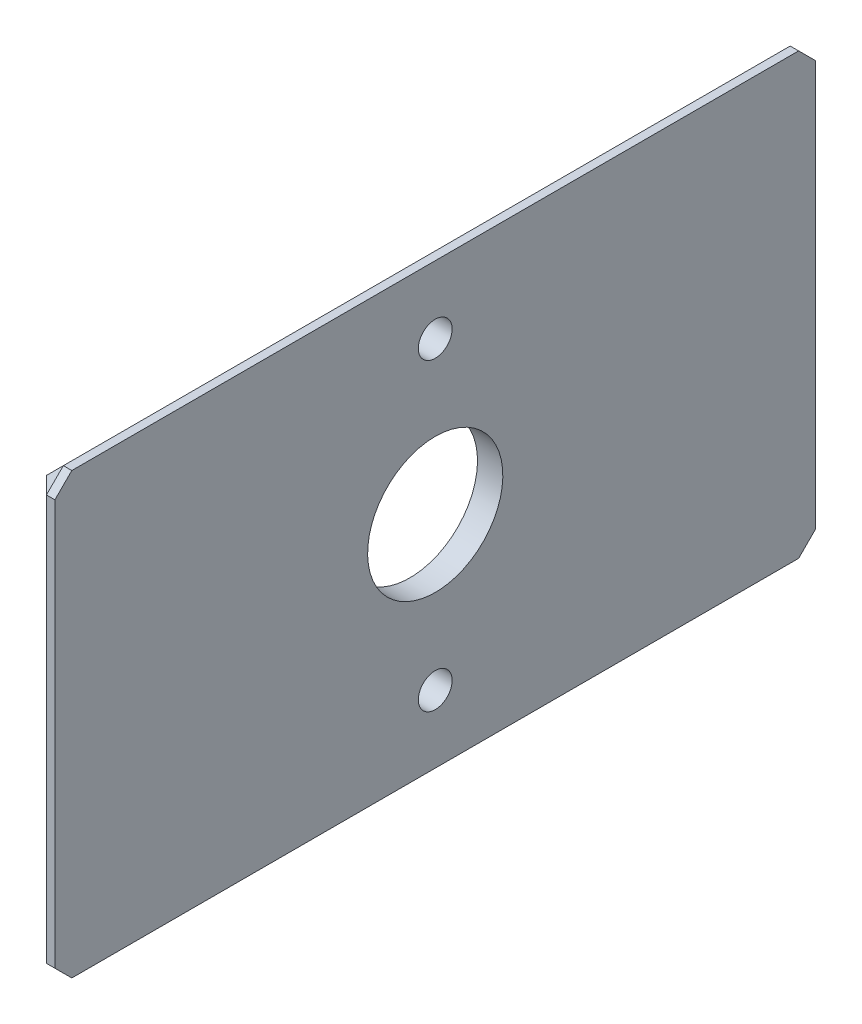
ISO-10303-21;
HEADER;
FILE_DESCRIPTION(('STEP AP214'),'2;1');
FILE_NAME('part.step','',(''),(''),'','','');
FILE_SCHEMA(('AUTOMOTIVE_DESIGN { 1 0 10303 214 1 1 1 1 }'));
ENDSEC;
DATA;
#1=APPLICATION_CONTEXT('core data for automotive mechanical design processes');
#2=APPLICATION_PROTOCOL_DEFINITION('international standard','automotive_design',2000,#1);
#3=PRODUCT_CONTEXT('',#1,'mechanical');
#4=PRODUCT('Part','Part','',(#3));
#5=PRODUCT_RELATED_PRODUCT_CATEGORY('part','',(#4));
#6=PRODUCT_DEFINITION_FORMATION('','',#4);
#7=PRODUCT_DEFINITION_CONTEXT('part definition',#1,'design');
#8=PRODUCT_DEFINITION('design','',#6,#7);
#9=PRODUCT_DEFINITION_SHAPE('','',#8);
#10=(LENGTH_UNIT() NAMED_UNIT(*) SI_UNIT(.MILLI.,.METRE.));
#11=(NAMED_UNIT(*) PLANE_ANGLE_UNIT() SI_UNIT($,.RADIAN.));
#12=(NAMED_UNIT(*) SI_UNIT($,.STERADIAN.) SOLID_ANGLE_UNIT());
#13=UNCERTAINTY_MEASURE_WITH_UNIT(LENGTH_MEASURE(1.E-05),#10,'distance_accuracy_value','');
#14=(GEOMETRIC_REPRESENTATION_CONTEXT(3) GLOBAL_UNCERTAINTY_ASSIGNED_CONTEXT((#13)) GLOBAL_UNIT_ASSIGNED_CONTEXT((#10,
#11,#12)) REPRESENTATION_CONTEXT('',''));
#15=CARTESIAN_POINT('',(0.,0.,0.));
#16=DIRECTION('',(0.,0.,1.));
#17=DIRECTION('',(1.,0.,0.));
#18=AXIS2_PLACEMENT_3D('',#15,#16,#17);
#19=CARTESIAN_POINT('',(-200.25,26.6166475996592,-182.364078786476));
#20=DIRECTION('',(-1.,0.,0.));
#21=DIRECTION('',(0.,-1.,0.));
#22=AXIS2_PLACEMENT_3D('',#19,#20,#21);
#23=CYLINDRICAL_SURFACE('',#22,1.);
#24=CARTESIAN_POINT('',(-201.75,26.6166475996592,-182.364078786476));
#25=DIRECTION('',(-1.,0.,0.));
#26=DIRECTION('',(0.,-1.,0.));
#27=AXIS2_PLACEMENT_3D('',#24,#25,#26);
#28=CIRCLE('',#27,1.);
#29=CARTESIAN_POINT('',(-201.75,27.6166475996592,-182.364078786476));
#30=VERTEX_POINT('',#29);
#31=EDGE_CURVE('E106',#30,#30,#28,.T.);
#32=ORIENTED_EDGE('',*,*,#31,.T.);
#33=DIRECTION('',(1.,0.,0.));
#34=VECTOR('',#33,1.);
#35=CARTESIAN_POINT('',(-200.25,27.6166475996592,-182.364078786476));
#36=LINE('',#35,#34);
#37=CARTESIAN_POINT('',(-200.25,27.6166475996592,-182.364078786476));
#38=VERTEX_POINT('',#37);
#39=EDGE_CURVE('E11',#30,#38,#36,.T.);
#40=ORIENTED_EDGE('',*,*,#39,.T.);
#41=CARTESIAN_POINT('',(-200.25,26.6166475996592,-182.364078786476));
#42=DIRECTION('',(1.,0.,0.));
#43=DIRECTION('',(0.,-1.,0.));
#44=AXIS2_PLACEMENT_3D('',#41,#42,#43);
#45=CIRCLE('',#44,1.);
#46=EDGE_CURVE('E118',#38,#38,#45,.T.);
#47=ORIENTED_EDGE('',*,*,#46,.T.);
#48=ORIENTED_EDGE('',*,*,#39,.F.);
#49=EDGE_LOOP('',(#32,#40,#47,#48));
#50=FACE_BOUND('',#49,.T.);
#51=ADVANCED_FACE('F49',(#50),#23,.F.);
#52=CARTESIAN_POINT('',(-200.25,44.6166475996592,-182.364078786476));
#53=DIRECTION('',(-1.,0.,0.));
#54=DIRECTION('',(0.,-1.,0.));
#55=AXIS2_PLACEMENT_3D('',#52,#53,#54);
#56=CYLINDRICAL_SURFACE('',#55,1.);
#57=CARTESIAN_POINT('',(-201.75,44.6166475996592,-182.364078786476));
#58=DIRECTION('',(-1.,0.,0.));
#59=DIRECTION('',(0.,-1.,0.));
#60=AXIS2_PLACEMENT_3D('',#57,#58,#59);
#61=CIRCLE('',#60,1.);
#62=CARTESIAN_POINT('',(-201.75,45.6166475996592,-182.364078786476));
#63=VERTEX_POINT('',#62);
#64=EDGE_CURVE('E111',#63,#63,#61,.T.);
#65=ORIENTED_EDGE('',*,*,#64,.T.);
#66=DIRECTION('',(1.,0.,0.));
#67=VECTOR('',#66,1.);
#68=CARTESIAN_POINT('',(-200.25,45.6166475996592,-182.364078786476));
#69=LINE('',#68,#67);
#70=CARTESIAN_POINT('',(-200.25,45.6166475996592,-182.364078786476));
#71=VERTEX_POINT('',#70);
#72=EDGE_CURVE('E52',#63,#71,#69,.T.);
#73=ORIENTED_EDGE('',*,*,#72,.T.);
#74=CARTESIAN_POINT('',(-200.25,44.6166475996592,-182.364078786476));
#75=DIRECTION('',(1.,0.,0.));
#76=DIRECTION('',(0.,-1.,0.));
#77=AXIS2_PLACEMENT_3D('',#74,#75,#76);
#78=CIRCLE('',#77,1.);
#79=EDGE_CURVE('E121',#71,#71,#78,.T.);
#80=ORIENTED_EDGE('',*,*,#79,.T.);
#81=ORIENTED_EDGE('',*,*,#72,.F.);
#82=EDGE_LOOP('',(#65,#73,#80,#81));
#83=FACE_BOUND('',#82,.T.);
#84=ADVANCED_FACE('F403',(#83),#56,.F.);
#85=CARTESIAN_POINT('',(-200.25,35.6166475996592,-182.364078786476));
#86=DIRECTION('',(-1.,0.,0.));
#87=DIRECTION('',(0.,-1.,0.));
#88=AXIS2_PLACEMENT_3D('',#85,#86,#87);
#89=CYLINDRICAL_SURFACE('',#88,4.);
#90=CARTESIAN_POINT('',(-201.75,35.6166475996592,-182.364078786476));
#91=DIRECTION('',(-1.,0.,0.));
#92=DIRECTION('',(0.,-1.,0.));
#93=AXIS2_PLACEMENT_3D('',#90,#91,#92);
#94=CIRCLE('',#93,4.);
#95=CARTESIAN_POINT('',(-201.75,39.6166475996592,-182.364078786476));
#96=VERTEX_POINT('',#95);
#97=EDGE_CURVE('E102',#96,#96,#94,.T.);
#98=ORIENTED_EDGE('',*,*,#97,.T.);
#99=DIRECTION('',(1.,0.,0.));
#100=VECTOR('',#99,1.);
#101=CARTESIAN_POINT('',(-200.25,39.6166475996592,-182.364078786476));
#102=LINE('',#101,#100);
#103=CARTESIAN_POINT('',(-200.25,39.6166475996592,-182.364078786476));
#104=VERTEX_POINT('',#103);
#105=EDGE_CURVE('E99',#96,#104,#102,.T.);
#106=ORIENTED_EDGE('',*,*,#105,.T.);
#107=CARTESIAN_POINT('',(-200.25,35.6166475996592,-182.364078786476));
#108=DIRECTION('',(1.,0.,0.));
#109=DIRECTION('',(0.,-1.,0.));
#110=AXIS2_PLACEMENT_3D('',#107,#108,#109);
#111=CIRCLE('',#110,4.);
#112=EDGE_CURVE('E104',#104,#104,#111,.T.);
#113=ORIENTED_EDGE('',*,*,#112,.T.);
#114=ORIENTED_EDGE('',*,*,#105,.F.);
#115=EDGE_LOOP('',(#98,#106,#113,#114));
#116=FACE_BOUND('',#115,.T.);
#117=ADVANCED_FACE('F100',(#116),#89,.F.);
#118=CARTESIAN_POINT('',(-182.75,22.6166475996592,-204.864078786476));
#119=DIRECTION('',(0.,1.,0.));
#120=DIRECTION('',(1.,0.,0.));
#121=AXIS2_PLACEMENT_3D('',#118,#119,#120);
#122=PLANE('',#121);
#123=DIRECTION('',(-1.,0.,0.));
#124=VECTOR('',#123,1.);
#125=CARTESIAN_POINT('',(-191.5,22.6166475996592,-203.864078786476));
#126=LINE('',#125,#124);
#127=CARTESIAN_POINT('',(-200.25,22.6166475996592,-203.864078786476));
#128=VERTEX_POINT('',#127);
#129=CARTESIAN_POINT('',(-200.75,22.6166475996592,-203.864078786476));
#130=VERTEX_POINT('',#129);
#131=EDGE_CURVE('E145',#128,#130,#126,.T.);
#132=ORIENTED_EDGE('',*,*,#131,.F.);
#133=DIRECTION('',(0.,0.,-1.));
#134=VECTOR('',#133,1.);
#135=CARTESIAN_POINT('',(-200.25,22.6166475996592,-193.614078786476));
#136=LINE('',#135,#134);
#137=CARTESIAN_POINT('',(-200.25,22.6166475996592,-160.864078786476));
#138=VERTEX_POINT('',#137);
#139=EDGE_CURVE('E127',#138,#128,#136,.T.);
#140=ORIENTED_EDGE('',*,*,#139,.F.);
#141=DIRECTION('',(1.,0.,0.));
#142=VECTOR('',#141,1.);
#143=CARTESIAN_POINT('',(-191.5,22.6166475996592,-160.864078786476));
#144=LINE('',#143,#142);
#145=CARTESIAN_POINT('',(-200.75,22.6166475996592,-160.864078786476));
#146=VERTEX_POINT('',#145);
#147=EDGE_CURVE('E190',#146,#138,#144,.T.);
#148=ORIENTED_EDGE('',*,*,#147,.F.);
#149=DIRECTION('',(0.,0.,1.));
#150=VECTOR('',#149,1.);
#151=CARTESIAN_POINT('',(-200.75,22.6166475996592,-193.614078786476));
#152=LINE('',#151,#150);
#153=EDGE_CURVE('E202',#130,#146,#152,.T.);
#154=ORIENTED_EDGE('',*,*,#153,.F.);
#155=EDGE_LOOP('',(#132,#140,#148,#154));
#156=FACE_BOUND('',#155,.T.);
#157=ADVANCED_FACE('F375',(#156),#122,.F.);
#158=CARTESIAN_POINT('',(-200.25,20.6166475996592,-159.864078786476));
#159=DIRECTION('',(0.,0.,1.));
#160=DIRECTION('',(1.,0.,0.));
#161=AXIS2_PLACEMENT_3D('',#158,#159,#160);
#162=PLANE('',#161);
#163=DIRECTION('',(-1.,0.,0.));
#164=VECTOR('',#163,1.);
#165=CARTESIAN_POINT('',(-191.5,23.6166475996592,-159.864078786476));
#166=LINE('',#165,#164);
#167=CARTESIAN_POINT('',(-200.25,23.6166475996592,-159.864078786476));
#168=VERTEX_POINT('',#167);
#169=CARTESIAN_POINT('',(-200.75,23.6166475996592,-159.864078786476));
#170=VERTEX_POINT('',#169);
#171=EDGE_CURVE('E193',#168,#170,#166,.T.);
#172=ORIENTED_EDGE('',*,*,#171,.F.);
#173=DIRECTION('',(0.,1.,0.));
#174=VECTOR('',#173,1.);
#175=CARTESIAN_POINT('',(-200.25,20.6166475996592,-159.864078786476));
#176=LINE('',#175,#174);
#177=CARTESIAN_POINT('',(-200.25,47.6166475996592,-159.864078786476));
#178=VERTEX_POINT('',#177);
#179=EDGE_CURVE('E130',#168,#178,#176,.T.);
#180=ORIENTED_EDGE('',*,*,#179,.T.);
#181=DIRECTION('',(1.,0.,0.));
#182=VECTOR('',#181,1.);
#183=CARTESIAN_POINT('',(-191.5,47.6166475996592,-159.864078786476));
#184=LINE('',#183,#182);
#185=CARTESIAN_POINT('',(-200.75,47.6166475996592,-159.864078786476));
#186=VERTEX_POINT('',#185);
#187=EDGE_CURVE('E158',#186,#178,#184,.T.);
#188=ORIENTED_EDGE('',*,*,#187,.F.);
#189=DIRECTION('',(0.,1.,0.));
#190=VECTOR('',#189,1.);
#191=CARTESIAN_POINT('',(-200.75,28.1166475996592,-159.864078786476));
#192=LINE('',#191,#190);
#193=EDGE_CURVE('E174',#170,#186,#192,.T.);
#194=ORIENTED_EDGE('',*,*,#193,.F.);
#195=EDGE_LOOP('',(#172,#180,#188,#194));
#196=FACE_BOUND('',#195,.T.);
#197=ADVANCED_FACE('F360',(#196),#162,.T.);
#198=CARTESIAN_POINT('',(-201.75,35.6166475996592,-182.364078786476));
#199=DIRECTION('',(-1.,0.,0.));
#200=DIRECTION('',(0.,0.,1.));
#201=AXIS2_PLACEMENT_3D('',#198,#199,#200);
#202=PLANE('',#201);
#203=ORIENTED_EDGE('',*,*,#31,.F.);
#204=EDGE_LOOP('',(#203));
#205=FACE_BOUND('',#204,.T.);
#206=ORIENTED_EDGE('',*,*,#64,.F.);
#207=EDGE_LOOP('',(#206));
#208=FACE_BOUND('',#207,.T.);
#209=ORIENTED_EDGE('',*,*,#97,.F.);
#210=EDGE_LOOP('',(#209));
#211=FACE_BOUND('',#210,.T.);
#212=DIRECTION('',(0.,1.,0.));
#213=VECTOR('',#212,1.);
#214=CARTESIAN_POINT('',(-201.75,43.1166475996592,-203.864078786476));
#215=LINE('',#214,#213);
#216=CARTESIAN_POINT('',(-201.75,23.6166475996592,-203.864078786476));
#217=VERTEX_POINT('',#216);
#218=CARTESIAN_POINT('',(-201.75,47.6166475996592,-203.864078786476));
#219=VERTEX_POINT('',#218);
#220=EDGE_CURVE('E216',#217,#219,#215,.T.);
#221=ORIENTED_EDGE('',*,*,#220,.F.);
#222=DIRECTION('',(0.,0.,-1.));
#223=VECTOR('',#222,1.);
#224=CARTESIAN_POINT('',(-201.75,23.6166475996592,-193.614078786476));
#225=LINE('',#224,#223);
#226=CARTESIAN_POINT('',(-201.75,23.6166475996592,-160.864078786476));
#227=VERTEX_POINT('',#226);
#228=EDGE_CURVE('E206',#227,#217,#225,.T.);
#229=ORIENTED_EDGE('',*,*,#228,.F.);
#230=DIRECTION('',(0.,-1.,0.));
#231=VECTOR('',#230,1.);
#232=CARTESIAN_POINT('',(-201.75,28.1166475996592,-160.864078786476));
#233=LINE('',#232,#231);
#234=CARTESIAN_POINT('',(-201.75,47.6166475996592,-160.864078786476));
#235=VERTEX_POINT('',#234);
#236=EDGE_CURVE('E170',#235,#227,#233,.T.);
#237=ORIENTED_EDGE('',*,*,#236,.F.);
#238=DIRECTION('',(0.,0.,1.));
#239=VECTOR('',#238,1.);
#240=CARTESIAN_POINT('',(-201.75,47.6166475996592,-171.114078786476));
#241=LINE('',#240,#239);
#242=EDGE_CURVE('E154',#219,#235,#241,.T.);
#243=ORIENTED_EDGE('',*,*,#242,.F.);
#244=EDGE_LOOP('',(#221,#229,#237,#243));
#245=FACE_BOUND('',#244,.T.);
#246=ADVANCED_FACE('F411',(#205,#208,#211,#245),#202,.T.);
#247=CARTESIAN_POINT('',(-200.25,35.6166475996592,-182.364078786476));
#248=DIRECTION('',(-1.,0.,0.));
#249=DIRECTION('',(0.,0.,1.));
#250=AXIS2_PLACEMENT_3D('',#247,#248,#249);
#251=PLANE('',#250);
#252=ORIENTED_EDGE('',*,*,#46,.F.);
#253=EDGE_LOOP('',(#252));
#254=FACE_BOUND('',#253,.T.);
#255=ORIENTED_EDGE('',*,*,#79,.F.);
#256=EDGE_LOOP('',(#255));
#257=FACE_BOUND('',#256,.T.);
#258=ORIENTED_EDGE('',*,*,#112,.F.);
#259=EDGE_LOOP('',(#258));
#260=FACE_BOUND('',#259,.T.);
#261=DIRECTION('',(0.,-0.707106781186538,0.707106781186557));
#262=VECTOR('',#261,1.);
#263=CARTESIAN_POINT('',(-200.25,20.7416475996591,-201.989078786475));
#264=LINE('',#263,#262);
#265=CARTESIAN_POINT('',(-200.25,23.6166475996592,-204.864078786476));
#266=VERTEX_POINT('',#265);
#267=EDGE_CURVE('E149',#266,#128,#264,.T.);
#268=ORIENTED_EDGE('',*,*,#267,.F.);
#269=DIRECTION('',(0.,-1.,0.));
#270=VECTOR('',#269,1.);
#271=CARTESIAN_POINT('',(-200.25,50.6166475996592,-204.864078786476));
#272=LINE('',#271,#270);
#273=CARTESIAN_POINT('',(-200.25,47.6166475996592,-204.864078786476));
#274=VERTEX_POINT('',#273);
#275=EDGE_CURVE('E135',#274,#266,#272,.T.);
#276=ORIENTED_EDGE('',*,*,#275,.F.);
#277=DIRECTION('',(0.,-0.707106781186538,-0.707106781186557));
#278=VECTOR('',#277,1.);
#279=CARTESIAN_POINT('',(-200.25,50.4916475996593,-201.989078786475));
#280=LINE('',#279,#278);
#281=CARTESIAN_POINT('',(-200.25,48.6166475996592,-203.864078786476));
#282=VERTEX_POINT('',#281);
#283=EDGE_CURVE('E232',#282,#274,#280,.T.);
#284=ORIENTED_EDGE('',*,*,#283,.F.);
#285=DIRECTION('',(0.,0.,1.));
#286=VECTOR('',#285,1.);
#287=CARTESIAN_POINT('',(-200.25,48.6166475996592,-171.114078786476));
#288=LINE('',#287,#286);
#289=CARTESIAN_POINT('',(-200.25,48.6166475996592,-160.864078786476));
#290=VERTEX_POINT('',#289);
#291=EDGE_CURVE('E131',#282,#290,#288,.T.);
#292=ORIENTED_EDGE('',*,*,#291,.T.);
#293=DIRECTION('',(0.,0.707106781186538,-0.707106781186557));
#294=VECTOR('',#293,1.);
#295=CARTESIAN_POINT('',(-200.25,50.4916475996593,-162.739078786476));
#296=LINE('',#295,#294);
#297=EDGE_CURVE('E166',#178,#290,#296,.T.);
#298=ORIENTED_EDGE('',*,*,#297,.F.);
#299=ORIENTED_EDGE('',*,*,#179,.F.);
#300=DIRECTION('',(0.,0.707106781186538,0.707106781186557));
#301=VECTOR('',#300,1.);
#302=CARTESIAN_POINT('',(-200.25,20.7416475996591,-162.739078786476));
#303=LINE('',#302,#301);
#304=EDGE_CURVE('E198',#138,#168,#303,.T.);
#305=ORIENTED_EDGE('',*,*,#304,.F.);
#306=ORIENTED_EDGE('',*,*,#139,.T.);
#307=EDGE_LOOP('',(#268,#276,#284,#292,#298,#299,#305,#306));
#308=FACE_BOUND('',#307,.T.);
#309=ADVANCED_FACE('F350',(#254,#257,#260,#308),#251,.F.);
#310=CARTESIAN_POINT('',(-182.75,48.6166475996592,-159.864078786476));
#311=DIRECTION('',(0.,-1.,0.));
#312=DIRECTION('',(0.,0.,-1.));
#313=AXIS2_PLACEMENT_3D('',#310,#311,#312);
#314=PLANE('',#313);
#315=DIRECTION('',(1.,0.,0.));
#316=VECTOR('',#315,1.);
#317=CARTESIAN_POINT('',(-191.5,48.6166475996592,-203.864078786476));
#318=LINE('',#317,#316);
#319=CARTESIAN_POINT('',(-200.75,48.6166475996592,-203.864078786476));
#320=VERTEX_POINT('',#319);
#321=EDGE_CURVE('E224',#320,#282,#318,.T.);
#322=ORIENTED_EDGE('',*,*,#321,.F.);
#323=DIRECTION('',(0.,0.,-1.));
#324=VECTOR('',#323,1.);
#325=CARTESIAN_POINT('',(-200.75,48.6166475996592,-171.114078786476));
#326=LINE('',#325,#324);
#327=CARTESIAN_POINT('',(-200.75,48.6166475996592,-160.864078786476));
#328=VERTEX_POINT('',#327);
#329=EDGE_CURVE('E153',#328,#320,#326,.T.);
#330=ORIENTED_EDGE('',*,*,#329,.F.);
#331=DIRECTION('',(-1.,0.,0.));
#332=VECTOR('',#331,1.);
#333=CARTESIAN_POINT('',(-191.5,48.6166475996592,-160.864078786476));
#334=LINE('',#333,#332);
#335=EDGE_CURVE('E161',#290,#328,#334,.T.);
#336=ORIENTED_EDGE('',*,*,#335,.F.);
#337=ORIENTED_EDGE('',*,*,#291,.F.);
#338=EDGE_LOOP('',(#322,#330,#336,#337));
#339=FACE_BOUND('',#338,.T.);
#340=ADVANCED_FACE('F354',(#339),#314,.F.);
#341=CARTESIAN_POINT('',(-200.25,50.6166475996592,-204.864078786476));
#342=DIRECTION('',(0.,0.,-1.));
#343=DIRECTION('',(0.,-1.,0.));
#344=AXIS2_PLACEMENT_3D('',#341,#342,#343);
#345=PLANE('',#344);
#346=DIRECTION('',(1.,0.,0.));
#347=VECTOR('',#346,1.);
#348=CARTESIAN_POINT('',(-191.5,23.6166475996592,-204.864078786476));
#349=LINE('',#348,#347);
#350=CARTESIAN_POINT('',(-200.75,23.6166475996592,-204.864078786476));
#351=VERTEX_POINT('',#350);
#352=EDGE_CURVE('E138',#351,#266,#349,.T.);
#353=ORIENTED_EDGE('',*,*,#352,.F.);
#354=DIRECTION('',(0.,-1.,0.));
#355=VECTOR('',#354,1.);
#356=CARTESIAN_POINT('',(-200.75,43.1166475996592,-204.864078786476));
#357=LINE('',#356,#355);
#358=CARTESIAN_POINT('',(-200.75,47.6166475996592,-204.864078786476));
#359=VERTEX_POINT('',#358);
#360=EDGE_CURVE('E220',#359,#351,#357,.T.);
#361=ORIENTED_EDGE('',*,*,#360,.F.);
#362=DIRECTION('',(-1.,0.,0.));
#363=VECTOR('',#362,1.);
#364=CARTESIAN_POINT('',(-191.5,47.6166475996592,-204.864078786476));
#365=LINE('',#364,#363);
#366=EDGE_CURVE('E231',#274,#359,#365,.T.);
#367=ORIENTED_EDGE('',*,*,#366,.F.);
#368=ORIENTED_EDGE('',*,*,#275,.T.);
#369=EDGE_LOOP('',(#353,#361,#367,#368));
#370=FACE_BOUND('',#369,.T.);
#371=ADVANCED_FACE('F378',(#370),#345,.T.);
#372=CARTESIAN_POINT('',(-191.5,23.1166475996592,-204.364078786476));
#373=DIRECTION('',(0.,-0.707106781186557,-0.707106781186538));
#374=DIRECTION('',(0.,0.707106781186538,-0.707106781186557));
#375=AXIS2_PLACEMENT_3D('',#372,#373,#374);
#376=PLANE('',#375);
#377=ORIENTED_EDGE('',*,*,#267,.T.);
#378=ORIENTED_EDGE('',*,*,#131,.T.);
#379=DIRECTION('',(0.,0.707106781186538,-0.707106781186557));
#380=VECTOR('',#379,1.);
#381=CARTESIAN_POINT('',(-200.75,22.6166475996592,-203.864078786476));
#382=LINE('',#381,#380);
#383=EDGE_CURVE('E254',#130,#351,#382,.T.);
#384=ORIENTED_EDGE('',*,*,#383,.T.);
#385=ORIENTED_EDGE('',*,*,#352,.T.);
#386=EDGE_LOOP('',(#377,#378,#384,#385));
#387=FACE_BOUND('',#386,.T.);
#388=ADVANCED_FACE('F376',(#387),#376,.T.);
#389=CARTESIAN_POINT('',(-201.25,48.1166475996592,-171.114078786476));
#390=DIRECTION('',(-0.707106781186543,0.707106781186552,0.));
#391=DIRECTION('',(0.,0.,1.));
#392=AXIS2_PLACEMENT_3D('',#389,#390,#391);
#393=PLANE('',#392);
#394=DIRECTION('',(-0.707106781186552,-0.707106781186543,0.));
#395=VECTOR('',#394,1.);
#396=CARTESIAN_POINT('',(-200.75,48.6166475996592,-203.864078786476));
#397=LINE('',#396,#395);
#398=EDGE_CURVE('E250',#320,#219,#397,.T.);
#399=ORIENTED_EDGE('',*,*,#398,.T.);
#400=ORIENTED_EDGE('',*,*,#242,.T.);
#401=DIRECTION('',(0.707106781186552,0.707106781186543,0.));
#402=VECTOR('',#401,1.);
#403=CARTESIAN_POINT('',(-201.75,47.6166475996592,-160.864078786476));
#404=LINE('',#403,#402);
#405=EDGE_CURVE('E186',#235,#328,#404,.T.);
#406=ORIENTED_EDGE('',*,*,#405,.T.);
#407=ORIENTED_EDGE('',*,*,#329,.T.);
#408=EDGE_LOOP('',(#399,#400,#406,#407));
#409=FACE_BOUND('',#408,.T.);
#410=ADVANCED_FACE('F387',(#409),#393,.T.);
#411=CARTESIAN_POINT('',(-191.5,48.1166475996592,-160.364078786476));
#412=DIRECTION('',(0.,0.707106781186557,0.707106781186538));
#413=DIRECTION('',(1.,0.,0.));
#414=AXIS2_PLACEMENT_3D('',#411,#412,#413);
#415=PLANE('',#414);
#416=ORIENTED_EDGE('',*,*,#297,.T.);
#417=ORIENTED_EDGE('',*,*,#335,.T.);
#418=DIRECTION('',(0.,-0.707106781186538,0.707106781186557));
#419=VECTOR('',#418,1.);
#420=CARTESIAN_POINT('',(-200.75,48.6166475996592,-160.864078786476));
#421=LINE('',#420,#419);
#422=EDGE_CURVE('E178',#328,#186,#421,.T.);
#423=ORIENTED_EDGE('',*,*,#422,.T.);
#424=ORIENTED_EDGE('',*,*,#187,.T.);
#425=EDGE_LOOP('',(#416,#417,#423,#424));
#426=FACE_BOUND('',#425,.T.);
#427=ADVANCED_FACE('F357',(#426),#415,.T.);
#428=CARTESIAN_POINT('',(-201.25,28.1166475996592,-160.364078786476));
#429=DIRECTION('',(-0.707106781186552,0.,0.707106781186543));
#430=DIRECTION('',(0.,1.,0.));
#431=AXIS2_PLACEMENT_3D('',#428,#429,#430);
#432=PLANE('',#431);
#433=DIRECTION('',(0.707106781186543,0.,0.707106781186552));
#434=VECTOR('',#433,1.);
#435=CARTESIAN_POINT('',(-201.75,23.6166475996592,-160.864078786476));
#436=LINE('',#435,#434);
#437=EDGE_CURVE('E212',#227,#170,#436,.T.);
#438=ORIENTED_EDGE('',*,*,#437,.T.);
#439=ORIENTED_EDGE('',*,*,#193,.T.);
#440=DIRECTION('',(-0.707106781186543,0.,-0.707106781186552));
#441=VECTOR('',#440,1.);
#442=CARTESIAN_POINT('',(-200.75,47.6166475996592,-159.864078786476));
#443=LINE('',#442,#441);
#444=EDGE_CURVE('E182',#186,#235,#443,.T.);
#445=ORIENTED_EDGE('',*,*,#444,.T.);
#446=ORIENTED_EDGE('',*,*,#236,.T.);
#447=EDGE_LOOP('',(#438,#439,#445,#446));
#448=FACE_BOUND('',#447,.T.);
#449=ADVANCED_FACE('F362',(#448),#432,.T.);
#450=CARTESIAN_POINT('',(-200.75,47.6166475996592,-159.864078786476));
#451=DIRECTION('',(-0.577350269189626,0.577350269189634,0.577350269189618));
#452=DIRECTION('',(0.707106781186543,0.,0.707106781186553));
#453=AXIS2_PLACEMENT_3D('',#450,#451,#452);
#454=PLANE('',#453);
#455=ORIENTED_EDGE('',*,*,#405,.F.);
#456=ORIENTED_EDGE('',*,*,#444,.F.);
#457=ORIENTED_EDGE('',*,*,#422,.F.);
#458=EDGE_LOOP('',(#455,#456,#457));
#459=FACE_BOUND('',#458,.T.);
#460=ADVANCED_FACE('F391',(#459),#454,.T.);
#461=CARTESIAN_POINT('',(-191.5,23.1166475996592,-160.364078786476));
#462=DIRECTION('',(0.,-0.707106781186557,0.707106781186538));
#463=DIRECTION('',(-1.,0.,0.));
#464=AXIS2_PLACEMENT_3D('',#461,#462,#463);
#465=PLANE('',#464);
#466=ORIENTED_EDGE('',*,*,#304,.T.);
#467=ORIENTED_EDGE('',*,*,#171,.T.);
#468=DIRECTION('',(0.,-0.707106781186538,-0.707106781186557));
#469=VECTOR('',#468,1.);
#470=CARTESIAN_POINT('',(-200.75,23.6166475996592,-159.864078786476));
#471=LINE('',#470,#469);
#472=EDGE_CURVE('E211',#170,#146,#471,.T.);
#473=ORIENTED_EDGE('',*,*,#472,.T.);
#474=ORIENTED_EDGE('',*,*,#147,.T.);
#475=EDGE_LOOP('',(#466,#467,#473,#474));
#476=FACE_BOUND('',#475,.T.);
#477=ADVANCED_FACE('F372',(#476),#465,.T.);
#478=CARTESIAN_POINT('',(-201.25,23.1166475996592,-193.614078786476));
#479=DIRECTION('',(-0.707106781186543,-0.707106781186552,0.));
#480=DIRECTION('',(-0.707106781186552,0.707106781186543,0.));
#481=AXIS2_PLACEMENT_3D('',#478,#479,#480);
#482=PLANE('',#481);
#483=DIRECTION('',(-0.707106781186552,0.707106781186543,0.));
#484=VECTOR('',#483,1.);
#485=CARTESIAN_POINT('',(-200.75,22.6166475996592,-160.864078786476));
#486=LINE('',#485,#484);
#487=EDGE_CURVE('E207',#146,#227,#486,.T.);
#488=ORIENTED_EDGE('',*,*,#487,.T.);
#489=ORIENTED_EDGE('',*,*,#228,.T.);
#490=DIRECTION('',(0.707106781186552,-0.707106781186543,0.));
#491=VECTOR('',#490,1.);
#492=CARTESIAN_POINT('',(-201.75,23.6166475996592,-203.864078786476));
#493=LINE('',#492,#491);
#494=EDGE_CURVE('E262',#217,#130,#493,.T.);
#495=ORIENTED_EDGE('',*,*,#494,.T.);
#496=ORIENTED_EDGE('',*,*,#153,.T.);
#497=EDGE_LOOP('',(#488,#489,#495,#496));
#498=FACE_BOUND('',#497,.T.);
#499=ADVANCED_FACE('F286',(#498),#482,.T.);
#500=CARTESIAN_POINT('',(-200.75,22.6166475996592,-160.864078786476));
#501=DIRECTION('',(-0.577350269189626,-0.577350269189634,0.577350269189618));
#502=DIRECTION('',(-0.707106781186553,0.707106781186543,0.));
#503=AXIS2_PLACEMENT_3D('',#500,#501,#502);
#504=PLANE('',#503);
#505=ORIENTED_EDGE('',*,*,#437,.F.);
#506=ORIENTED_EDGE('',*,*,#487,.F.);
#507=ORIENTED_EDGE('',*,*,#472,.F.);
#508=EDGE_LOOP('',(#505,#506,#507));
#509=FACE_BOUND('',#508,.T.);
#510=ADVANCED_FACE('F370',(#509),#504,.T.);
#511=CARTESIAN_POINT('',(-201.25,43.1166475996592,-204.364078786476));
#512=DIRECTION('',(-0.707106781186552,0.,-0.707106781186543));
#513=DIRECTION('',(-0.707106781186543,0.,0.707106781186552));
#514=AXIS2_PLACEMENT_3D('',#511,#512,#513);
#515=PLANE('',#514);
#516=DIRECTION('',(0.707106781186543,0.,-0.707106781186552));
#517=VECTOR('',#516,1.);
#518=CARTESIAN_POINT('',(-201.75,47.6166475996592,-203.864078786476));
#519=LINE('',#518,#517);
#520=EDGE_CURVE('E236',#219,#359,#519,.T.);
#521=ORIENTED_EDGE('',*,*,#520,.T.);
#522=ORIENTED_EDGE('',*,*,#360,.T.);
#523=DIRECTION('',(-0.707106781186543,0.,0.707106781186552));
#524=VECTOR('',#523,1.);
#525=CARTESIAN_POINT('',(-200.75,23.6166475996592,-204.864078786476));
#526=LINE('',#525,#524);
#527=EDGE_CURVE('E261',#351,#217,#526,.T.);
#528=ORIENTED_EDGE('',*,*,#527,.T.);
#529=ORIENTED_EDGE('',*,*,#220,.T.);
#530=EDGE_LOOP('',(#521,#522,#528,#529));
#531=FACE_BOUND('',#530,.T.);
#532=ADVANCED_FACE('F273',(#531),#515,.T.);
#533=CARTESIAN_POINT('',(-191.5,48.1166475996592,-204.364078786476));
#534=DIRECTION('',(0.,0.707106781186557,-0.707106781186538));
#535=DIRECTION('',(-1.,0.,0.));
#536=AXIS2_PLACEMENT_3D('',#533,#534,#535);
#537=PLANE('',#536);
#538=ORIENTED_EDGE('',*,*,#283,.T.);
#539=ORIENTED_EDGE('',*,*,#366,.T.);
#540=DIRECTION('',(0.,0.707106781186538,0.707106781186557));
#541=VECTOR('',#540,1.);
#542=CARTESIAN_POINT('',(-200.75,47.6166475996592,-204.864078786476));
#543=LINE('',#542,#541);
#544=EDGE_CURVE('E240',#359,#320,#543,.T.);
#545=ORIENTED_EDGE('',*,*,#544,.T.);
#546=ORIENTED_EDGE('',*,*,#321,.T.);
#547=EDGE_LOOP('',(#538,#539,#545,#546));
#548=FACE_BOUND('',#547,.T.);
#549=ADVANCED_FACE('F381',(#548),#537,.T.);
#550=CARTESIAN_POINT('',(-200.75,47.6166475996592,-204.864078786476));
#551=DIRECTION('',(-0.577350269189626,0.577350269189634,-0.577350269189618));
#552=DIRECTION('',(-0.707106781186543,0.,0.707106781186553));
#553=AXIS2_PLACEMENT_3D('',#550,#551,#552);
#554=PLANE('',#553);
#555=ORIENTED_EDGE('',*,*,#398,.F.);
#556=ORIENTED_EDGE('',*,*,#544,.F.);
#557=ORIENTED_EDGE('',*,*,#520,.F.);
#558=EDGE_LOOP('',(#555,#556,#557));
#559=FACE_BOUND('',#558,.T.);
#560=ADVANCED_FACE('F385',(#559),#554,.T.);
#561=CARTESIAN_POINT('',(-200.75,23.6166475996592,-204.864078786476));
#562=DIRECTION('',(-0.577350269189626,-0.577350269189634,-0.577350269189618));
#563=DIRECTION('',(-0.707106781186553,0.707106781186543,0.));
#564=AXIS2_PLACEMENT_3D('',#561,#562,#563);
#565=PLANE('',#564);
#566=ORIENTED_EDGE('',*,*,#494,.F.);
#567=ORIENTED_EDGE('',*,*,#527,.F.);
#568=ORIENTED_EDGE('',*,*,#383,.F.);
#569=EDGE_LOOP('',(#566,#567,#568));
#570=FACE_BOUND('',#569,.T.);
#571=ADVANCED_FACE('F284',(#570),#565,.T.);
#572=CLOSED_SHELL('',(#51,#84,#117,#157,#197,#246,#309,#340,#371,#388,#410,#427,#449,#460,#477,
#499,#510,#532,#549,#560,#571));
#573=MANIFOLD_SOLID_BREP('B2',#572);
#574=ADVANCED_BREP_SHAPE_REPRESENTATION('',(#18,#573),#14);
#575=SHAPE_DEFINITION_REPRESENTATION(#9,#574);
ENDSEC;
END-ISO-10303-21;
